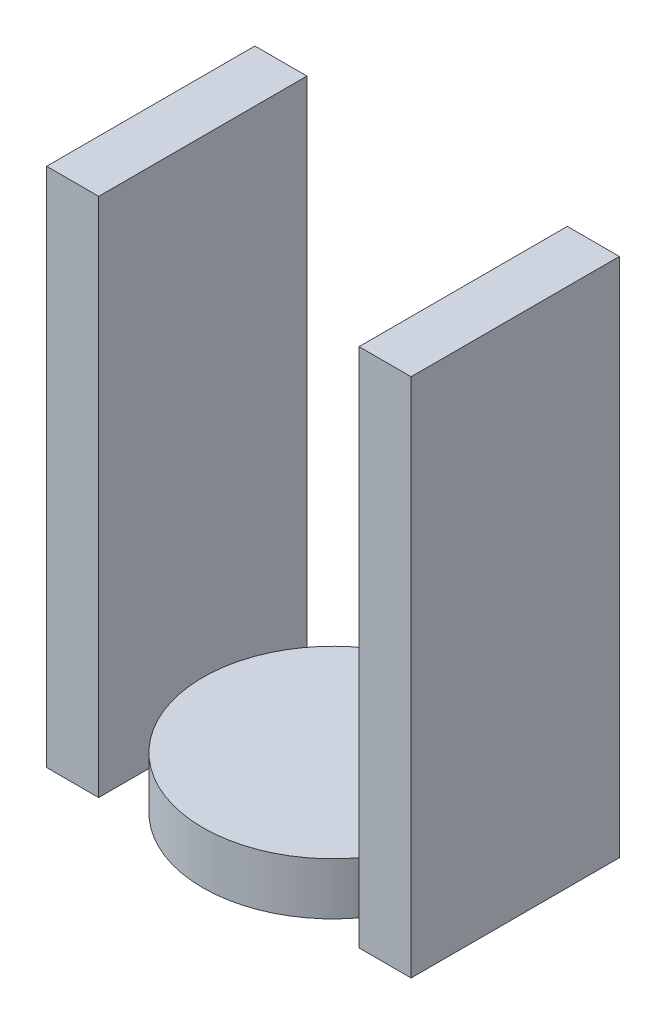
ISO-10303-21;
HEADER;
FILE_DESCRIPTION(('STEP AP214'),'2;1');
FILE_NAME('part.step','',(''),(''),'','','');
FILE_SCHEMA(('AUTOMOTIVE_DESIGN { 1 0 10303 214 1 1 1 1 }'));
ENDSEC;
DATA;
#1=APPLICATION_CONTEXT('core data for automotive mechanical design processes');
#2=APPLICATION_PROTOCOL_DEFINITION('international standard','automotive_design',2000,#1);
#3=PRODUCT_CONTEXT('',#1,'mechanical');
#4=PRODUCT('Part','Part','',(#3));
#5=PRODUCT_RELATED_PRODUCT_CATEGORY('part','',(#4));
#6=PRODUCT_DEFINITION_FORMATION('','',#4);
#7=PRODUCT_DEFINITION_CONTEXT('part definition',#1,'design');
#8=PRODUCT_DEFINITION('design','',#6,#7);
#9=PRODUCT_DEFINITION_SHAPE('','',#8);
#10=(LENGTH_UNIT() NAMED_UNIT(*) SI_UNIT(.MILLI.,.METRE.));
#11=(NAMED_UNIT(*) PLANE_ANGLE_UNIT() SI_UNIT($,.RADIAN.));
#12=(NAMED_UNIT(*) SI_UNIT($,.STERADIAN.) SOLID_ANGLE_UNIT());
#13=UNCERTAINTY_MEASURE_WITH_UNIT(LENGTH_MEASURE(1.E-05),#10,'distance_accuracy_value','');
#14=(GEOMETRIC_REPRESENTATION_CONTEXT(3) GLOBAL_UNCERTAINTY_ASSIGNED_CONTEXT((#13)) GLOBAL_UNIT_ASSIGNED_CONTEXT((#10,
#11,#12)) REPRESENTATION_CONTEXT('',''));
#15=CARTESIAN_POINT('',(0.,0.,0.));
#16=DIRECTION('',(0.,0.,1.));
#17=DIRECTION('',(1.,0.,0.));
#18=AXIS2_PLACEMENT_3D('',#15,#16,#17);
#19=CARTESIAN_POINT('',(17.5,50.,-10.));
#20=DIRECTION('',(-1.,0.,0.));
#21=DIRECTION('',(0.,0.,1.));
#22=AXIS2_PLACEMENT_3D('',#19,#20,#21);
#23=PLANE('',#22);
#24=DIRECTION('',(0.,0.,-1.));
#25=VECTOR('',#24,1.);
#26=CARTESIAN_POINT('',(17.5,0.,-10.));
#27=LINE('',#26,#25);
#28=CARTESIAN_POINT('',(17.5,0.,10.));
#29=VERTEX_POINT('',#28);
#30=CARTESIAN_POINT('',(17.5,0.,-10.));
#31=VERTEX_POINT('',#30);
#32=EDGE_CURVE('E107',#29,#31,#27,.T.);
#33=ORIENTED_EDGE('',*,*,#32,.T.);
#34=DIRECTION('',(0.,-1.,0.));
#35=VECTOR('',#34,1.);
#36=CARTESIAN_POINT('',(17.5,50.,-10.));
#37=LINE('',#36,#35);
#38=CARTESIAN_POINT('',(17.5,50.,-10.));
#39=VERTEX_POINT('',#38);
#40=EDGE_CURVE('E12',#39,#31,#37,.T.);
#41=ORIENTED_EDGE('',*,*,#40,.F.);
#42=DIRECTION('',(0.,0.,-1.));
#43=VECTOR('',#42,1.);
#44=CARTESIAN_POINT('',(17.5,50.,-10.));
#45=LINE('',#44,#43);
#46=CARTESIAN_POINT('',(17.5,50.,10.));
#47=VERTEX_POINT('',#46);
#48=EDGE_CURVE('E95',#47,#39,#45,.T.);
#49=ORIENTED_EDGE('',*,*,#48,.F.);
#50=DIRECTION('',(0.,-1.,0.));
#51=VECTOR('',#50,1.);
#52=CARTESIAN_POINT('',(17.5,50.,10.));
#53=LINE('',#52,#51);
#54=EDGE_CURVE('E103',#47,#29,#53,.T.);
#55=ORIENTED_EDGE('',*,*,#54,.T.);
#56=EDGE_LOOP('',(#33,#41,#49,#55));
#57=FACE_BOUND('',#56,.T.);
#58=ADVANCED_FACE('F44',(#57),#23,.F.);
#59=CARTESIAN_POINT('',(17.5,50.,-10.));
#60=DIRECTION('',(0.,0.,1.));
#61=DIRECTION('',(1.,0.,0.));
#62=AXIS2_PLACEMENT_3D('',#59,#60,#61);
#63=PLANE('',#62);
#64=DIRECTION('',(-1.,0.,0.));
#65=VECTOR('',#64,1.);
#66=CARTESIAN_POINT('',(17.5,0.,-10.));
#67=LINE('',#66,#65);
#68=CARTESIAN_POINT('',(12.5,0.,-10.));
#69=VERTEX_POINT('',#68);
#70=EDGE_CURVE('E99',#31,#69,#67,.T.);
#71=ORIENTED_EDGE('',*,*,#70,.T.);
#72=DIRECTION('',(0.,-1.,0.));
#73=VECTOR('',#72,1.);
#74=CARTESIAN_POINT('',(12.5,50.,-10.));
#75=LINE('',#74,#73);
#76=CARTESIAN_POINT('',(12.5,50.,-10.));
#77=VERTEX_POINT('',#76);
#78=EDGE_CURVE('E52',#77,#69,#75,.T.);
#79=ORIENTED_EDGE('',*,*,#78,.F.);
#80=DIRECTION('',(-1.,0.,0.));
#81=VECTOR('',#80,1.);
#82=CARTESIAN_POINT('',(17.5,50.,-10.));
#83=LINE('',#82,#81);
#84=EDGE_CURVE('E90',#39,#77,#83,.T.);
#85=ORIENTED_EDGE('',*,*,#84,.F.);
#86=ORIENTED_EDGE('',*,*,#40,.T.);
#87=EDGE_LOOP('',(#71,#79,#85,#86));
#88=FACE_BOUND('',#87,.T.);
#89=ADVANCED_FACE('F98',(#88),#63,.F.);
#90=CARTESIAN_POINT('',(12.5,50.,-10.));
#91=DIRECTION('',(1.,0.,0.));
#92=DIRECTION('',(0.,0.,-1.));
#93=AXIS2_PLACEMENT_3D('',#90,#91,#92);
#94=PLANE('',#93);
#95=DIRECTION('',(0.,0.,1.));
#96=VECTOR('',#95,1.);
#97=CARTESIAN_POINT('',(12.5,0.,-10.));
#98=LINE('',#97,#96);
#99=CARTESIAN_POINT('',(12.5,0.,10.));
#100=VERTEX_POINT('',#99);
#101=EDGE_CURVE('E77',#69,#100,#98,.T.);
#102=ORIENTED_EDGE('',*,*,#101,.T.);
#103=DIRECTION('',(0.,-1.,0.));
#104=VECTOR('',#103,1.);
#105=CARTESIAN_POINT('',(12.5,50.,10.));
#106=LINE('',#105,#104);
#107=CARTESIAN_POINT('',(12.5,50.,10.));
#108=VERTEX_POINT('',#107);
#109=EDGE_CURVE('E100',#108,#100,#106,.T.);
#110=ORIENTED_EDGE('',*,*,#109,.F.);
#111=DIRECTION('',(0.,0.,1.));
#112=VECTOR('',#111,1.);
#113=CARTESIAN_POINT('',(12.5,50.,-10.));
#114=LINE('',#113,#112);
#115=EDGE_CURVE('E93',#77,#108,#114,.T.);
#116=ORIENTED_EDGE('',*,*,#115,.F.);
#117=ORIENTED_EDGE('',*,*,#78,.T.);
#118=EDGE_LOOP('',(#102,#110,#116,#117));
#119=FACE_BOUND('',#118,.T.);
#120=ADVANCED_FACE('F101',(#119),#94,.F.);
#121=CARTESIAN_POINT('',(17.5,50.,10.));
#122=DIRECTION('',(0.,0.,-1.));
#123=DIRECTION('',(-1.,0.,0.));
#124=AXIS2_PLACEMENT_3D('',#121,#122,#123);
#125=PLANE('',#124);
#126=DIRECTION('',(1.,0.,0.));
#127=VECTOR('',#126,1.);
#128=CARTESIAN_POINT('',(17.5,0.,10.));
#129=LINE('',#128,#127);
#130=EDGE_CURVE('E83',#100,#29,#129,.T.);
#131=ORIENTED_EDGE('',*,*,#130,.T.);
#132=ORIENTED_EDGE('',*,*,#54,.F.);
#133=DIRECTION('',(1.,0.,0.));
#134=VECTOR('',#133,1.);
#135=CARTESIAN_POINT('',(17.5,50.,10.));
#136=LINE('',#135,#134);
#137=EDGE_CURVE('E60',#108,#47,#136,.T.);
#138=ORIENTED_EDGE('',*,*,#137,.F.);
#139=ORIENTED_EDGE('',*,*,#109,.T.);
#140=EDGE_LOOP('',(#131,#132,#138,#139));
#141=FACE_BOUND('',#140,.T.);
#142=ADVANCED_FACE('F114',(#141),#125,.F.);
#143=CARTESIAN_POINT('',(0.,50.,0.));
#144=DIRECTION('',(0.,-1.,0.));
#145=DIRECTION('',(0.,0.,-1.));
#146=AXIS2_PLACEMENT_3D('',#143,#144,#145);
#147=PLANE('',#146);
#148=ORIENTED_EDGE('',*,*,#48,.T.);
#149=ORIENTED_EDGE('',*,*,#84,.T.);
#150=ORIENTED_EDGE('',*,*,#115,.T.);
#151=ORIENTED_EDGE('',*,*,#137,.T.);
#152=EDGE_LOOP('',(#148,#149,#150,#151));
#153=FACE_BOUND('',#152,.T.);
#154=ADVANCED_FACE('F91',(#153),#147,.F.);
#155=CARTESIAN_POINT('',(0.,0.,0.));
#156=DIRECTION('',(0.,-1.,0.));
#157=DIRECTION('',(0.,0.,-1.));
#158=AXIS2_PLACEMENT_3D('',#155,#156,#157);
#159=PLANE('',#158);
#160=ORIENTED_EDGE('',*,*,#32,.F.);
#161=ORIENTED_EDGE('',*,*,#130,.F.);
#162=ORIENTED_EDGE('',*,*,#101,.F.);
#163=ORIENTED_EDGE('',*,*,#70,.F.);
#164=EDGE_LOOP('',(#160,#161,#162,#163));
#165=FACE_BOUND('',#164,.T.);
#166=ADVANCED_FACE('F117',(#165),#159,.T.);
#167=CLOSED_SHELL('',(#58,#89,#120,#142,#154,#166));
#168=MANIFOLD_SOLID_BREP('B2',#167);
#169=CARTESIAN_POINT('',(-17.5,50.,-10.));
#170=DIRECTION('',(1.,0.,0.));
#171=DIRECTION('',(0.,0.,-1.));
#172=AXIS2_PLACEMENT_3D('',#169,#170,#171);
#173=PLANE('',#172);
#174=DIRECTION('',(0.,0.,1.));
#175=VECTOR('',#174,1.);
#176=CARTESIAN_POINT('',(-17.5,0.,-10.));
#177=LINE('',#176,#175);
#178=CARTESIAN_POINT('',(-17.5,0.,-10.));
#179=VERTEX_POINT('',#178);
#180=CARTESIAN_POINT('',(-17.5,0.,10.));
#181=VERTEX_POINT('',#180);
#182=EDGE_CURVE('E238',#179,#181,#177,.T.);
#183=ORIENTED_EDGE('',*,*,#182,.T.);
#184=DIRECTION('',(0.,-1.,0.));
#185=VECTOR('',#184,1.);
#186=CARTESIAN_POINT('',(-17.5,50.,10.));
#187=LINE('',#186,#185);
#188=CARTESIAN_POINT('',(-17.5,50.,10.));
#189=VERTEX_POINT('',#188);
#190=EDGE_CURVE('E42',#189,#181,#187,.T.);
#191=ORIENTED_EDGE('',*,*,#190,.F.);
#192=DIRECTION('',(0.,0.,1.));
#193=VECTOR('',#192,1.);
#194=CARTESIAN_POINT('',(-17.5,50.,-10.));
#195=LINE('',#194,#193);
#196=CARTESIAN_POINT('',(-17.5,50.,-10.));
#197=VERTEX_POINT('',#196);
#198=EDGE_CURVE('E226',#197,#189,#195,.T.);
#199=ORIENTED_EDGE('',*,*,#198,.F.);
#200=DIRECTION('',(0.,-1.,0.));
#201=VECTOR('',#200,1.);
#202=CARTESIAN_POINT('',(-17.5,50.,-10.));
#203=LINE('',#202,#201);
#204=EDGE_CURVE('E234',#197,#179,#203,.T.);
#205=ORIENTED_EDGE('',*,*,#204,.T.);
#206=EDGE_LOOP('',(#183,#191,#199,#205));
#207=FACE_BOUND('',#206,.T.);
#208=ADVANCED_FACE('F175',(#207),#173,.F.);
#209=CARTESIAN_POINT('',(-17.5,50.,10.));
#210=DIRECTION('',(0.,0.,-1.));
#211=DIRECTION('',(-1.,0.,0.));
#212=AXIS2_PLACEMENT_3D('',#209,#210,#211);
#213=PLANE('',#212);
#214=DIRECTION('',(1.,0.,0.));
#215=VECTOR('',#214,1.);
#216=CARTESIAN_POINT('',(-17.5,0.,10.));
#217=LINE('',#216,#215);
#218=CARTESIAN_POINT('',(-12.5,0.,10.));
#219=VERTEX_POINT('',#218);
#220=EDGE_CURVE('E230',#181,#219,#217,.T.);
#221=ORIENTED_EDGE('',*,*,#220,.T.);
#222=DIRECTION('',(0.,-1.,0.));
#223=VECTOR('',#222,1.);
#224=CARTESIAN_POINT('',(-12.5,50.,10.));
#225=LINE('',#224,#223);
#226=CARTESIAN_POINT('',(-12.5,50.,10.));
#227=VERTEX_POINT('',#226);
#228=EDGE_CURVE('E183',#227,#219,#225,.T.);
#229=ORIENTED_EDGE('',*,*,#228,.F.);
#230=DIRECTION('',(1.,0.,0.));
#231=VECTOR('',#230,1.);
#232=CARTESIAN_POINT('',(-17.5,50.,10.));
#233=LINE('',#232,#231);
#234=EDGE_CURVE('E221',#189,#227,#233,.T.);
#235=ORIENTED_EDGE('',*,*,#234,.F.);
#236=ORIENTED_EDGE('',*,*,#190,.T.);
#237=EDGE_LOOP('',(#221,#229,#235,#236));
#238=FACE_BOUND('',#237,.T.);
#239=ADVANCED_FACE('F229',(#238),#213,.F.);
#240=CARTESIAN_POINT('',(-12.5,50.,-10.));
#241=DIRECTION('',(-1.,0.,0.));
#242=DIRECTION('',(0.,0.,1.));
#243=AXIS2_PLACEMENT_3D('',#240,#241,#242);
#244=PLANE('',#243);
#245=DIRECTION('',(0.,0.,-1.));
#246=VECTOR('',#245,1.);
#247=CARTESIAN_POINT('',(-12.5,0.,-10.));
#248=LINE('',#247,#246);
#249=CARTESIAN_POINT('',(-12.5,0.,-10.));
#250=VERTEX_POINT('',#249);
#251=EDGE_CURVE('E208',#219,#250,#248,.T.);
#252=ORIENTED_EDGE('',*,*,#251,.T.);
#253=DIRECTION('',(0.,-1.,0.));
#254=VECTOR('',#253,1.);
#255=CARTESIAN_POINT('',(-12.5,50.,-10.));
#256=LINE('',#255,#254);
#257=CARTESIAN_POINT('',(-12.5,50.,-10.));
#258=VERTEX_POINT('',#257);
#259=EDGE_CURVE('E231',#258,#250,#256,.T.);
#260=ORIENTED_EDGE('',*,*,#259,.F.);
#261=DIRECTION('',(0.,0.,-1.));
#262=VECTOR('',#261,1.);
#263=CARTESIAN_POINT('',(-12.5,50.,-10.));
#264=LINE('',#263,#262);
#265=EDGE_CURVE('E224',#227,#258,#264,.T.);
#266=ORIENTED_EDGE('',*,*,#265,.F.);
#267=ORIENTED_EDGE('',*,*,#228,.T.);
#268=EDGE_LOOP('',(#252,#260,#266,#267));
#269=FACE_BOUND('',#268,.T.);
#270=ADVANCED_FACE('F232',(#269),#244,.F.);
#271=CARTESIAN_POINT('',(-17.5,50.,-10.));
#272=DIRECTION('',(0.,0.,1.));
#273=DIRECTION('',(1.,0.,0.));
#274=AXIS2_PLACEMENT_3D('',#271,#272,#273);
#275=PLANE('',#274);
#276=DIRECTION('',(-1.,0.,0.));
#277=VECTOR('',#276,1.);
#278=CARTESIAN_POINT('',(-17.5,0.,-10.));
#279=LINE('',#278,#277);
#280=EDGE_CURVE('E214',#250,#179,#279,.T.);
#281=ORIENTED_EDGE('',*,*,#280,.T.);
#282=ORIENTED_EDGE('',*,*,#204,.F.);
#283=DIRECTION('',(-1.,0.,0.));
#284=VECTOR('',#283,1.);
#285=CARTESIAN_POINT('',(-17.5,50.,-10.));
#286=LINE('',#285,#284);
#287=EDGE_CURVE('E191',#258,#197,#286,.T.);
#288=ORIENTED_EDGE('',*,*,#287,.F.);
#289=ORIENTED_EDGE('',*,*,#259,.T.);
#290=EDGE_LOOP('',(#281,#282,#288,#289));
#291=FACE_BOUND('',#290,.T.);
#292=ADVANCED_FACE('F245',(#291),#275,.F.);
#293=CARTESIAN_POINT('',(0.,50.,0.));
#294=DIRECTION('',(0.,1.,0.));
#295=DIRECTION('',(0.,0.,1.));
#296=AXIS2_PLACEMENT_3D('',#293,#294,#295);
#297=PLANE('',#296);
#298=ORIENTED_EDGE('',*,*,#198,.T.);
#299=ORIENTED_EDGE('',*,*,#234,.T.);
#300=ORIENTED_EDGE('',*,*,#265,.T.);
#301=ORIENTED_EDGE('',*,*,#287,.T.);
#302=EDGE_LOOP('',(#298,#299,#300,#301));
#303=FACE_BOUND('',#302,.T.);
#304=ADVANCED_FACE('F222',(#303),#297,.T.);
#305=CARTESIAN_POINT('',(0.,0.,0.));
#306=DIRECTION('',(0.,1.,0.));
#307=DIRECTION('',(0.,0.,1.));
#308=AXIS2_PLACEMENT_3D('',#305,#306,#307);
#309=PLANE('',#308);
#310=ORIENTED_EDGE('',*,*,#182,.F.);
#311=ORIENTED_EDGE('',*,*,#280,.F.);
#312=ORIENTED_EDGE('',*,*,#251,.F.);
#313=ORIENTED_EDGE('',*,*,#220,.F.);
#314=EDGE_LOOP('',(#310,#311,#312,#313));
#315=FACE_BOUND('',#314,.T.);
#316=ADVANCED_FACE('F248',(#315),#309,.F.);
#317=CLOSED_SHELL('',(#208,#239,#270,#292,#304,#316));
#318=MANIFOLD_SOLID_BREP('B6',#317);
#319=CARTESIAN_POINT('',(0.,5.,0.));
#320=DIRECTION('',(0.,-1.,0.));
#321=DIRECTION('',(0.,0.,-1.));
#322=AXIS2_PLACEMENT_3D('',#319,#320,#321);
#323=CYLINDRICAL_SURFACE('',#322,12.5);
#324=CARTESIAN_POINT('',(0.,0.,0.));
#325=DIRECTION('',(0.,1.,0.));
#326=DIRECTION('',(0.,0.,1.));
#327=AXIS2_PLACEMENT_3D('',#324,#325,#326);
#328=CIRCLE('',#327,12.5);
#329=CARTESIAN_POINT('',(0.,0.,12.5));
#330=VERTEX_POINT('',#329);
#331=EDGE_CURVE('E302',#330,#330,#328,.T.);
#332=ORIENTED_EDGE('',*,*,#331,.T.);
#333=EDGE_LOOP('',(#332));
#334=FACE_BOUND('',#333,.T.);
#335=CARTESIAN_POINT('',(0.,5.,0.));
#336=DIRECTION('',(0.,1.,0.));
#337=DIRECTION('',(0.,0.,1.));
#338=AXIS2_PLACEMENT_3D('',#335,#336,#337);
#339=CIRCLE('',#338,12.5);
#340=CARTESIAN_POINT('',(0.,5.,12.5));
#341=VERTEX_POINT('',#340);
#342=EDGE_CURVE('E174',#341,#341,#339,.T.);
#343=ORIENTED_EDGE('',*,*,#342,.F.);
#344=EDGE_LOOP('',(#343));
#345=FACE_BOUND('',#344,.T.);
#346=ADVANCED_FACE('F299',(#334,#345),#323,.T.);
#347=CARTESIAN_POINT('',(0.,5.,0.));
#348=DIRECTION('',(0.,1.,0.));
#349=DIRECTION('',(0.,0.,1.));
#350=AXIS2_PLACEMENT_3D('',#347,#348,#349);
#351=PLANE('',#350);
#352=ORIENTED_EDGE('',*,*,#342,.T.);
#353=EDGE_LOOP('',(#352));
#354=FACE_BOUND('',#353,.T.);
#355=ADVANCED_FACE('F315',(#354),#351,.T.);
#356=CARTESIAN_POINT('',(0.,0.,0.));
#357=DIRECTION('',(0.,1.,0.));
#358=DIRECTION('',(0.,0.,1.));
#359=AXIS2_PLACEMENT_3D('',#356,#357,#358);
#360=PLANE('',#359);
#361=ORIENTED_EDGE('',*,*,#331,.F.);
#362=EDGE_LOOP('',(#361));
#363=FACE_BOUND('',#362,.T.);
#364=ADVANCED_FACE('F313',(#363),#360,.F.);
#365=CLOSED_SHELL('',(#346,#355,#364));
#366=MANIFOLD_SOLID_BREP('B36',#365);
#367=ADVANCED_BREP_SHAPE_REPRESENTATION('',(#18,#168,#318,#366),#14);
#368=SHAPE_DEFINITION_REPRESENTATION(#9,#367);
ENDSEC;
END-ISO-10303-21;
